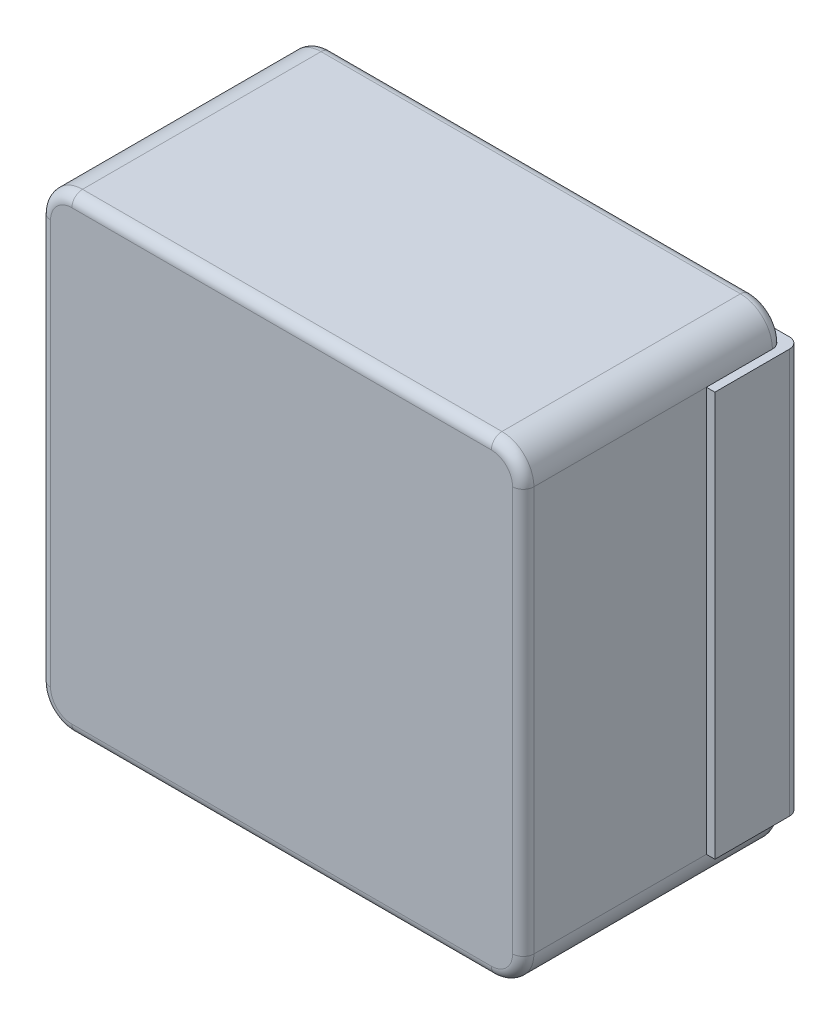
ISO-10303-21;
HEADER;
FILE_DESCRIPTION(('STEP AP214'),'2;1');
FILE_NAME('part.step','',(''),(''),'','','');
FILE_SCHEMA(('AUTOMOTIVE_DESIGN { 1 0 10303 214 1 1 1 1 }'));
ENDSEC;
DATA;
#1=APPLICATION_CONTEXT('core data for automotive mechanical design processes');
#2=APPLICATION_PROTOCOL_DEFINITION('international standard','automotive_design',2000,#1);
#3=PRODUCT_CONTEXT('',#1,'mechanical');
#4=PRODUCT('Part','Part','',(#3));
#5=PRODUCT_RELATED_PRODUCT_CATEGORY('part','',(#4));
#6=PRODUCT_DEFINITION_FORMATION('','',#4);
#7=PRODUCT_DEFINITION_CONTEXT('part definition',#1,'design');
#8=PRODUCT_DEFINITION('design','',#6,#7);
#9=PRODUCT_DEFINITION_SHAPE('','',#8);
#10=(LENGTH_UNIT() NAMED_UNIT(*) SI_UNIT(.MILLI.,.METRE.));
#11=(NAMED_UNIT(*) PLANE_ANGLE_UNIT() SI_UNIT($,.RADIAN.));
#12=(NAMED_UNIT(*) SI_UNIT($,.STERADIAN.) SOLID_ANGLE_UNIT());
#13=UNCERTAINTY_MEASURE_WITH_UNIT(LENGTH_MEASURE(1.E-05),#10,'distance_accuracy_value','');
#14=(GEOMETRIC_REPRESENTATION_CONTEXT(3) GLOBAL_UNCERTAINTY_ASSIGNED_CONTEXT((#13)) GLOBAL_UNIT_ASSIGNED_CONTEXT((#10,
#11,#12)) REPRESENTATION_CONTEXT('',''));
#15=CARTESIAN_POINT('',(0.,0.,0.));
#16=DIRECTION('',(0.,0.,1.));
#17=DIRECTION('',(1.,0.,0.));
#18=AXIS2_PLACEMENT_3D('',#15,#16,#17);
#19=CARTESIAN_POINT('',(-0.5625,-0.475,0.025));
#20=DIRECTION('',(0.,1.,0.));
#21=DIRECTION('',(0.,0.,1.));
#22=AXIS2_PLACEMENT_3D('',#19,#20,#21);
#23=CYLINDRICAL_SURFACE('',#22,0.0250000000000009);
#24=DIRECTION('',(0.,1.,0.));
#25=VECTOR('',#24,1.);
#26=CARTESIAN_POINT('',(-0.5625,0.,0.));
#27=LINE('',#26,#25);
#28=CARTESIAN_POINT('',(-0.5625,-0.475,0.));
#29=VERTEX_POINT('',#28);
#30=CARTESIAN_POINT('',(-0.5625,0.475,0.));
#31=VERTEX_POINT('',#30);
#32=EDGE_CURVE('E493',#29,#31,#27,.T.);
#33=ORIENTED_EDGE('',*,*,#32,.F.);
#34=CARTESIAN_POINT('',(-0.5625,-0.475,0.025));
#35=DIRECTION('',(0.,1.,0.));
#36=DIRECTION('',(0.,0.,1.));
#37=AXIS2_PLACEMENT_3D('',#34,#35,#36);
#38=CIRCLE('',#37,0.0250000000000009);
#39=CARTESIAN_POINT('',(-0.5875,-0.475,0.025));
#40=VERTEX_POINT('',#39);
#41=EDGE_CURVE('E21',#40,#29,#38,.F.);
#42=ORIENTED_EDGE('',*,*,#41,.F.);
#43=DIRECTION('',(0.,-1.,0.));
#44=VECTOR('',#43,1.);
#45=CARTESIAN_POINT('',(-0.5875,0.,0.025));
#46=LINE('',#45,#44);
#47=CARTESIAN_POINT('',(-0.5875,0.475,0.025));
#48=VERTEX_POINT('',#47);
#49=EDGE_CURVE('E138',#48,#40,#46,.T.);
#50=ORIENTED_EDGE('',*,*,#49,.F.);
#51=CARTESIAN_POINT('',(-0.5625,0.475,0.025));
#52=DIRECTION('',(0.,1.,0.));
#53=DIRECTION('',(0.,0.,1.));
#54=AXIS2_PLACEMENT_3D('',#51,#52,#53);
#55=CIRCLE('',#54,0.0250000000000009);
#56=EDGE_CURVE('E434',#31,#48,#55,.T.);
#57=ORIENTED_EDGE('',*,*,#56,.F.);
#58=EDGE_LOOP('',(#33,#42,#50,#57));
#59=FACE_BOUND('',#58,.T.);
#60=ADVANCED_FACE('F17',(#59),#23,.T.);
#61=CARTESIAN_POINT('',(-0.5875,-0.475,0.2));
#62=DIRECTION('',(-1.,0.,0.));
#63=DIRECTION('',(0.,1.,0.));
#64=AXIS2_PLACEMENT_3D('',#61,#62,#63);
#65=PLANE('',#64);
#66=DIRECTION('',(0.,0.,1.));
#67=VECTOR('',#66,1.);
#68=CARTESIAN_POINT('',(-0.5875,0.475,0.1));
#69=LINE('',#68,#67);
#70=CARTESIAN_POINT('',(-0.5875,0.475,0.2));
#71=VERTEX_POINT('',#70);
#72=EDGE_CURVE('E431',#48,#71,#69,.T.);
#73=ORIENTED_EDGE('',*,*,#72,.F.);
#74=ORIENTED_EDGE('',*,*,#49,.T.);
#75=DIRECTION('',(0.,0.,-1.));
#76=VECTOR('',#75,1.);
#77=CARTESIAN_POINT('',(-0.5875,-0.475,0.1));
#78=LINE('',#77,#76);
#79=CARTESIAN_POINT('',(-0.5875,-0.475,0.2));
#80=VERTEX_POINT('',#79);
#81=EDGE_CURVE('E468',#80,#40,#78,.T.);
#82=ORIENTED_EDGE('',*,*,#81,.F.);
#83=DIRECTION('',(0.,1.,0.));
#84=VECTOR('',#83,1.);
#85=CARTESIAN_POINT('',(-0.5875,0.,0.2));
#86=LINE('',#85,#84);
#87=EDGE_CURVE('E447',#80,#71,#86,.T.);
#88=ORIENTED_EDGE('',*,*,#87,.T.);
#89=EDGE_LOOP('',(#73,#74,#82,#88));
#90=FACE_BOUND('',#89,.T.);
#91=ADVANCED_FACE('F654',(#90),#65,.T.);
#92=CARTESIAN_POINT('',(-0.3375,0.475,0.02));
#93=DIRECTION('',(1.,0.,0.));
#94=DIRECTION('',(0.,-1.,0.));
#95=AXIS2_PLACEMENT_3D('',#92,#93,#94);
#96=PLANE('',#95);
#97=DIRECTION('',(0.,1.,0.));
#98=VECTOR('',#97,1.);
#99=CARTESIAN_POINT('',(-0.3375,0.,0.02));
#100=LINE('',#99,#98);
#101=CARTESIAN_POINT('',(-0.3375,-0.475,0.02));
#102=VERTEX_POINT('',#101);
#103=CARTESIAN_POINT('',(-0.3375,0.475,0.02));
#104=VERTEX_POINT('',#103);
#105=EDGE_CURVE('E484',#102,#104,#100,.T.);
#106=ORIENTED_EDGE('',*,*,#105,.F.);
#107=DIRECTION('',(0.,0.,1.));
#108=VECTOR('',#107,1.);
#109=CARTESIAN_POINT('',(-0.3375,-0.475,0.1));
#110=LINE('',#109,#108);
#111=CARTESIAN_POINT('',(-0.3375,-0.475,0.));
#112=VERTEX_POINT('',#111);
#113=EDGE_CURVE('E461',#112,#102,#110,.T.);
#114=ORIENTED_EDGE('',*,*,#113,.F.);
#115=DIRECTION('',(0.,-1.,0.));
#116=VECTOR('',#115,1.);
#117=CARTESIAN_POINT('',(-0.3375,0.,0.));
#118=LINE('',#117,#116);
#119=CARTESIAN_POINT('',(-0.3375,0.475,0.));
#120=VERTEX_POINT('',#119);
#121=EDGE_CURVE('E151',#120,#112,#118,.T.);
#122=ORIENTED_EDGE('',*,*,#121,.F.);
#123=DIRECTION('',(0.,0.,-1.));
#124=VECTOR('',#123,1.);
#125=CARTESIAN_POINT('',(-0.3375,0.475,0.1));
#126=LINE('',#125,#124);
#127=EDGE_CURVE('E422',#104,#120,#126,.T.);
#128=ORIENTED_EDGE('',*,*,#127,.F.);
#129=EDGE_LOOP('',(#106,#114,#122,#128));
#130=FACE_BOUND('',#129,.T.);
#131=ADVANCED_FACE('F656',(#130),#96,.T.);
#132=CARTESIAN_POINT('',(-0.3375,-0.475,0.));
#133=DIRECTION('',(0.,0.,-1.));
#134=DIRECTION('',(-1.,0.,0.));
#135=AXIS2_PLACEMENT_3D('',#132,#133,#134);
#136=PLANE('',#135);
#137=DIRECTION('',(1.,0.,0.));
#138=VECTOR('',#137,1.);
#139=CARTESIAN_POINT('',(-0.4625,-0.475,0.));
#140=LINE('',#139,#138);
#141=EDGE_CURVE('E464',#29,#112,#140,.T.);
#142=ORIENTED_EDGE('',*,*,#141,.F.);
#143=ORIENTED_EDGE('',*,*,#32,.T.);
#144=DIRECTION('',(-1.,0.,0.));
#145=VECTOR('',#144,1.);
#146=CARTESIAN_POINT('',(-0.4625,0.475,0.));
#147=LINE('',#146,#145);
#148=EDGE_CURVE('E419',#120,#31,#147,.T.);
#149=ORIENTED_EDGE('',*,*,#148,.F.);
#150=ORIENTED_EDGE('',*,*,#121,.T.);
#151=EDGE_LOOP('',(#142,#143,#149,#150));
#152=FACE_BOUND('',#151,.T.);
#153=ADVANCED_FACE('F663',(#152),#136,.T.);
#154=CARTESIAN_POINT('',(0.5625,0.475,0.025));
#155=DIRECTION('',(0.,-1.,0.));
#156=DIRECTION('',(0.,0.,-1.));
#157=AXIS2_PLACEMENT_3D('',#154,#155,#156);
#158=CYLINDRICAL_SURFACE('',#157,0.0250000000000009);
#159=DIRECTION('',(0.,-1.,0.));
#160=VECTOR('',#159,1.);
#161=CARTESIAN_POINT('',(0.5625,0.,0.));
#162=LINE('',#161,#160);
#163=CARTESIAN_POINT('',(0.5625,0.475,0.));
#164=VERTEX_POINT('',#163);
#165=CARTESIAN_POINT('',(0.5625,-0.475,0.));
#166=VERTEX_POINT('',#165);
#167=EDGE_CURVE('E473',#164,#166,#162,.T.);
#168=ORIENTED_EDGE('',*,*,#167,.F.);
#169=CARTESIAN_POINT('',(0.5625,0.475,0.025));
#170=DIRECTION('',(0.,-1.,0.));
#171=DIRECTION('',(0.,0.,-1.));
#172=AXIS2_PLACEMENT_3D('',#169,#170,#171);
#173=CIRCLE('',#172,0.0250000000000009);
#174=CARTESIAN_POINT('',(0.5875,0.475,0.025));
#175=VERTEX_POINT('',#174);
#176=EDGE_CURVE('E395',#175,#164,#173,.F.);
#177=ORIENTED_EDGE('',*,*,#176,.F.);
#178=DIRECTION('',(0.,1.,0.));
#179=VECTOR('',#178,1.);
#180=CARTESIAN_POINT('',(0.5875,0.,0.025));
#181=LINE('',#180,#179);
#182=CARTESIAN_POINT('',(0.5875,-0.475,0.025));
#183=VERTEX_POINT('',#182);
#184=EDGE_CURVE('E491',#183,#175,#181,.T.);
#185=ORIENTED_EDGE('',*,*,#184,.F.);
#186=CARTESIAN_POINT('',(0.5625,-0.475,0.025));
#187=DIRECTION('',(0.,-1.,0.));
#188=DIRECTION('',(0.,0.,-1.));
#189=AXIS2_PLACEMENT_3D('',#186,#187,#188);
#190=CIRCLE('',#189,0.0250000000000009);
#191=EDGE_CURVE('E337',#166,#183,#190,.T.);
#192=ORIENTED_EDGE('',*,*,#191,.F.);
#193=EDGE_LOOP('',(#168,#177,#185,#192));
#194=FACE_BOUND('',#193,.T.);
#195=ADVANCED_FACE('F756',(#194),#158,.T.);
#196=CARTESIAN_POINT('',(0.5875,0.475,0.2));
#197=DIRECTION('',(1.,0.,0.));
#198=DIRECTION('',(0.,-1.,0.));
#199=AXIS2_PLACEMENT_3D('',#196,#197,#198);
#200=PLANE('',#199);
#201=DIRECTION('',(0.,0.,1.));
#202=VECTOR('',#201,1.);
#203=CARTESIAN_POINT('',(0.5875,-0.475,0.1));
#204=LINE('',#203,#202);
#205=CARTESIAN_POINT('',(0.5875,-0.475,0.2));
#206=VERTEX_POINT('',#205);
#207=EDGE_CURVE('E334',#183,#206,#204,.T.);
#208=ORIENTED_EDGE('',*,*,#207,.F.);
#209=ORIENTED_EDGE('',*,*,#184,.T.);
#210=DIRECTION('',(0.,0.,-1.));
#211=VECTOR('',#210,1.);
#212=CARTESIAN_POINT('',(0.5875,0.475,0.1));
#213=LINE('',#212,#211);
#214=CARTESIAN_POINT('',(0.5875,0.475,0.2));
#215=VERTEX_POINT('',#214);
#216=EDGE_CURVE('E398',#215,#175,#213,.T.);
#217=ORIENTED_EDGE('',*,*,#216,.F.);
#218=DIRECTION('',(0.,-1.,0.));
#219=VECTOR('',#218,1.);
#220=CARTESIAN_POINT('',(0.5875,0.,0.2));
#221=LINE('',#220,#219);
#222=EDGE_CURVE('E353',#215,#206,#221,.T.);
#223=ORIENTED_EDGE('',*,*,#222,.T.);
#224=EDGE_LOOP('',(#208,#209,#217,#223));
#225=FACE_BOUND('',#224,.T.);
#226=ADVANCED_FACE('F753',(#225),#200,.T.);
#227=CARTESIAN_POINT('',(0.5425,-0.525,0.02));
#228=DIRECTION('',(0.,0.,-1.));
#229=DIRECTION('',(-1.,0.,0.));
#230=AXIS2_PLACEMENT_3D('',#227,#228,#229);
#231=PLANE('',#230);
#232=ORIENTED_EDGE('',*,*,#105,.T.);
#233=DIRECTION('',(1.,0.,0.));
#234=VECTOR('',#233,1.);
#235=CARTESIAN_POINT('',(-0.4625,0.475,0.02));
#236=LINE('',#235,#234);
#237=CARTESIAN_POINT('',(-0.5425,0.475,0.0199999999999995));
#238=VERTEX_POINT('',#237);
#239=EDGE_CURVE('E425',#238,#104,#236,.T.);
#240=ORIENTED_EDGE('',*,*,#239,.F.);
#241=CARTESIAN_POINT('',(-0.4925,0.475,0.019999999999999));
#242=DIRECTION('',(0.,0.,-1.));
#243=DIRECTION('',(-1.,0.,0.));
#244=AXIS2_PLACEMENT_3D('',#241,#242,#243);
#245=CIRCLE('',#244,0.05);
#246=CARTESIAN_POINT('',(-0.4925,0.525,0.0199999999999995));
#247=VERTEX_POINT('',#246);
#248=EDGE_CURVE('E446',#247,#238,#245,.F.);
#249=ORIENTED_EDGE('',*,*,#248,.F.);
#250=DIRECTION('',(-1.,0.,0.));
#251=VECTOR('',#250,1.);
#252=CARTESIAN_POINT('',(0.,0.525,0.02));
#253=LINE('',#252,#251);
#254=CARTESIAN_POINT('',(0.4925,0.525,0.0199999999999996));
#255=VERTEX_POINT('',#254);
#256=EDGE_CURVE('E405',#255,#247,#253,.T.);
#257=ORIENTED_EDGE('',*,*,#256,.F.);
#258=CARTESIAN_POINT('',(0.4925,0.475,0.0199999999999991));
#259=DIRECTION('',(0.,0.,-1.));
#260=DIRECTION('',(-1.,0.,0.));
#261=AXIS2_PLACEMENT_3D('',#258,#259,#260);
#262=CIRCLE('',#261,0.05);
#263=CARTESIAN_POINT('',(0.5425,0.475,0.0199999999999996));
#264=VERTEX_POINT('',#263);
#265=EDGE_CURVE('E371',#264,#255,#262,.F.);
#266=ORIENTED_EDGE('',*,*,#265,.F.);
#267=DIRECTION('',(1.,0.,0.));
#268=VECTOR('',#267,1.);
#269=CARTESIAN_POINT('',(0.4625,0.475,0.02));
#270=LINE('',#269,#268);
#271=CARTESIAN_POINT('',(0.3375,0.475,0.02));
#272=VERTEX_POINT('',#271);
#273=EDGE_CURVE('E385',#272,#264,#270,.T.);
#274=ORIENTED_EDGE('',*,*,#273,.F.);
#275=DIRECTION('',(0.,1.,0.));
#276=VECTOR('',#275,1.);
#277=CARTESIAN_POINT('',(0.3375,0.,0.02));
#278=LINE('',#277,#276);
#279=CARTESIAN_POINT('',(0.3375,-0.475,0.02));
#280=VERTEX_POINT('',#279);
#281=EDGE_CURVE('E476',#280,#272,#278,.T.);
#282=ORIENTED_EDGE('',*,*,#281,.F.);
#283=DIRECTION('',(-1.,0.,0.));
#284=VECTOR('',#283,1.);
#285=CARTESIAN_POINT('',(0.4625,-0.475,0.02));
#286=LINE('',#285,#284);
#287=CARTESIAN_POINT('',(0.5425,-0.475,0.0199999999999995));
#288=VERTEX_POINT('',#287);
#289=EDGE_CURVE('E329',#288,#280,#286,.T.);
#290=ORIENTED_EDGE('',*,*,#289,.F.);
#291=CARTESIAN_POINT('',(0.4925,-0.475,0.019999999999999));
#292=DIRECTION('',(0.,0.,-1.));
#293=DIRECTION('',(-1.,0.,0.));
#294=AXIS2_PLACEMENT_3D('',#291,#292,#293);
#295=CIRCLE('',#294,0.05);
#296=CARTESIAN_POINT('',(0.4925,-0.525,0.0199999999999995));
#297=VERTEX_POINT('',#296);
#298=EDGE_CURVE('E352',#297,#288,#295,.F.);
#299=ORIENTED_EDGE('',*,*,#298,.F.);
#300=DIRECTION('',(1.,0.,0.));
#301=VECTOR('',#300,1.);
#302=CARTESIAN_POINT('',(0.,-0.525,0.02));
#303=LINE('',#302,#301);
#304=CARTESIAN_POINT('',(-0.4925,-0.525,0.0199999999999996));
#305=VERTEX_POINT('',#304);
#306=EDGE_CURVE('E470',#305,#297,#303,.T.);
#307=ORIENTED_EDGE('',*,*,#306,.F.);
#308=CARTESIAN_POINT('',(-0.4925,-0.475,0.0199999999999991));
#309=DIRECTION('',(0.,0.,-1.));
#310=DIRECTION('',(-1.,0.,0.));
#311=AXIS2_PLACEMENT_3D('',#308,#309,#310);
#312=CIRCLE('',#311,0.05);
#313=CARTESIAN_POINT('',(-0.5425,-0.475,0.0199999999999996));
#314=VERTEX_POINT('',#313);
#315=EDGE_CURVE('E513',#314,#305,#312,.F.);
#316=ORIENTED_EDGE('',*,*,#315,.F.);
#317=DIRECTION('',(-1.,0.,0.));
#318=VECTOR('',#317,1.);
#319=CARTESIAN_POINT('',(-0.4625,-0.475,0.02));
#320=LINE('',#319,#318);
#321=EDGE_CURVE('E457',#102,#314,#320,.T.);
#322=ORIENTED_EDGE('',*,*,#321,.F.);
#323=EDGE_LOOP('',(#232,#240,#249,#257,#266,#274,#282,#290,#299,#307,#316,#322));
#324=FACE_BOUND('',#323,.T.);
#325=ADVANCED_FACE('F554',(#324),#231,.T.);
#326=CARTESIAN_POINT('',(0.3375,-0.475,0.02));
#327=DIRECTION('',(-1.,0.,0.));
#328=DIRECTION('',(0.,1.,0.));
#329=AXIS2_PLACEMENT_3D('',#326,#327,#328);
#330=PLANE('',#329);
#331=ORIENTED_EDGE('',*,*,#281,.T.);
#332=DIRECTION('',(0.,0.,1.));
#333=VECTOR('',#332,1.);
#334=CARTESIAN_POINT('',(0.3375,0.475,0.1));
#335=LINE('',#334,#333);
#336=CARTESIAN_POINT('',(0.3375,0.475,0.));
#337=VERTEX_POINT('',#336);
#338=EDGE_CURVE('E389',#337,#272,#335,.T.);
#339=ORIENTED_EDGE('',*,*,#338,.F.);
#340=DIRECTION('',(0.,1.,0.));
#341=VECTOR('',#340,1.);
#342=CARTESIAN_POINT('',(0.3375,0.,0.));
#343=LINE('',#342,#341);
#344=CARTESIAN_POINT('',(0.3375,-0.475,0.));
#345=VERTEX_POINT('',#344);
#346=EDGE_CURVE('E475',#345,#337,#343,.T.);
#347=ORIENTED_EDGE('',*,*,#346,.F.);
#348=DIRECTION('',(0.,0.,-1.));
#349=VECTOR('',#348,1.);
#350=CARTESIAN_POINT('',(0.3375,-0.475,0.1));
#351=LINE('',#350,#349);
#352=EDGE_CURVE('E326',#280,#345,#351,.T.);
#353=ORIENTED_EDGE('',*,*,#352,.F.);
#354=EDGE_LOOP('',(#331,#339,#347,#353));
#355=FACE_BOUND('',#354,.T.);
#356=ADVANCED_FACE('F746',(#355),#330,.T.);
#357=CARTESIAN_POINT('',(0.5625,-0.475,0.));
#358=DIRECTION('',(0.,0.,-1.));
#359=DIRECTION('',(-1.,0.,0.));
#360=AXIS2_PLACEMENT_3D('',#357,#358,#359);
#361=PLANE('',#360);
#362=DIRECTION('',(1.,0.,0.));
#363=VECTOR('',#362,1.);
#364=CARTESIAN_POINT('',(0.4625,-0.475,0.));
#365=LINE('',#364,#363);
#366=EDGE_CURVE('E323',#345,#166,#365,.T.);
#367=ORIENTED_EDGE('',*,*,#366,.F.);
#368=ORIENTED_EDGE('',*,*,#346,.T.);
#369=DIRECTION('',(-1.,0.,0.));
#370=VECTOR('',#369,1.);
#371=CARTESIAN_POINT('',(0.4625,0.475,0.));
#372=LINE('',#371,#370);
#373=EDGE_CURVE('E392',#164,#337,#372,.T.);
#374=ORIENTED_EDGE('',*,*,#373,.F.);
#375=ORIENTED_EDGE('',*,*,#167,.T.);
#376=EDGE_LOOP('',(#367,#368,#374,#375));
#377=FACE_BOUND('',#376,.T.);
#378=ADVANCED_FACE('F743',(#377),#361,.T.);
#379=CARTESIAN_POINT('',(0.4925,-0.525,0.045));
#380=DIRECTION('',(-1.,0.,0.));
#381=DIRECTION('',(0.,0.,1.));
#382=AXIS2_PLACEMENT_3D('',#379,#380,#381);
#383=CYLINDRICAL_SURFACE('',#382,0.0250000000000009);
#384=ORIENTED_EDGE('',*,*,#306,.T.);
#385=CARTESIAN_POINT('',(0.4925,-0.525,0.045));
#386=DIRECTION('',(1.,0.,0.));
#387=DIRECTION('',(0.,-1.,0.));
#388=AXIS2_PLACEMENT_3D('',#385,#386,#387);
#389=CIRCLE('',#388,0.0250000000000009);
#390=CARTESIAN_POINT('',(0.4925,-0.550000000000001,0.045));
#391=VERTEX_POINT('',#390);
#392=EDGE_CURVE('E349',#391,#297,#389,.T.);
#393=ORIENTED_EDGE('',*,*,#392,.F.);
#394=DIRECTION('',(1.,0.,0.));
#395=VECTOR('',#394,1.);
#396=CARTESIAN_POINT('',(0.,-0.55,0.045));
#397=LINE('',#396,#395);
#398=CARTESIAN_POINT('',(-0.4925,-0.550000000000001,0.045));
#399=VERTEX_POINT('',#398);
#400=EDGE_CURVE('E236',#399,#391,#397,.T.);
#401=ORIENTED_EDGE('',*,*,#400,.F.);
#402=CARTESIAN_POINT('',(-0.4925,-0.525,0.045));
#403=DIRECTION('',(-1.,0.,0.));
#404=DIRECTION('',(0.,-1.,0.));
#405=AXIS2_PLACEMENT_3D('',#402,#403,#404);
#406=CIRCLE('',#405,0.0250000000000009);
#407=EDGE_CURVE('E454',#305,#399,#406,.T.);
#408=ORIENTED_EDGE('',*,*,#407,.F.);
#409=EDGE_LOOP('',(#384,#393,#401,#408));
#410=FACE_BOUND('',#409,.T.);
#411=ADVANCED_FACE('F558',(#410),#383,.T.);
#412=CARTESIAN_POINT('',(-0.3375,-0.475,0.2));
#413=DIRECTION('',(0.,-1.,0.));
#414=DIRECTION('',(-1.,0.,0.));
#415=AXIS2_PLACEMENT_3D('',#412,#413,#414);
#416=PLANE('',#415);
#417=DIRECTION('',(0.,0.,-1.));
#418=VECTOR('',#417,1.);
#419=CARTESIAN_POINT('',(-0.5675,-0.475,0.325));
#420=LINE('',#419,#418);
#421=CARTESIAN_POINT('',(-0.5675,-0.475,0.2));
#422=VERTEX_POINT('',#421);
#423=CARTESIAN_POINT('',(-0.567500000000001,-0.475,0.045));
#424=VERTEX_POINT('',#423);
#425=EDGE_CURVE('E357',#422,#424,#420,.T.);
#426=ORIENTED_EDGE('',*,*,#425,.F.);
#427=DIRECTION('',(-1.,0.,0.));
#428=VECTOR('',#427,1.);
#429=CARTESIAN_POINT('',(-0.5775,-0.475,0.2));
#430=LINE('',#429,#428);
#431=EDGE_CURVE('E443',#422,#80,#430,.T.);
#432=ORIENTED_EDGE('',*,*,#431,.T.);
#433=ORIENTED_EDGE('',*,*,#81,.T.);
#434=ORIENTED_EDGE('',*,*,#41,.T.);
#435=ORIENTED_EDGE('',*,*,#141,.T.);
#436=ORIENTED_EDGE('',*,*,#113,.T.);
#437=ORIENTED_EDGE('',*,*,#321,.T.);
#438=CARTESIAN_POINT('',(-0.5425,-0.475,0.045));
#439=DIRECTION('',(0.,-1.,0.));
#440=DIRECTION('',(0.,0.,-1.));
#441=AXIS2_PLACEMENT_3D('',#438,#439,#440);
#442=CIRCLE('',#441,0.0250000000000009);
#443=EDGE_CURVE('E456',#424,#314,#442,.T.);
#444=ORIENTED_EDGE('',*,*,#443,.F.);
#445=EDGE_LOOP('',(#426,#432,#433,#434,#435,#436,#437,#444));
#446=FACE_BOUND('',#445,.T.);
#447=ADVANCED_FACE('F638',(#446),#416,.T.);
#448=CARTESIAN_POINT('',(-0.4925,-0.475,0.045));
#449=DIRECTION('',(0.,0.,-1.));
#450=DIRECTION('',(-1.,0.,0.));
#451=AXIS2_PLACEMENT_3D('',#448,#449,#450);
#452=TOROIDAL_SURFACE('',#451,0.05,0.0250000000000009);
#453=ORIENTED_EDGE('',*,*,#443,.T.);
#454=ORIENTED_EDGE('',*,*,#315,.T.);
#455=ORIENTED_EDGE('',*,*,#407,.T.);
#456=CARTESIAN_POINT('',(-0.4925,-0.475,0.045));
#457=DIRECTION('',(0.,0.,1.));
#458=DIRECTION('',(-1.,0.,0.));
#459=AXIS2_PLACEMENT_3D('',#456,#457,#458);
#460=CIRCLE('',#459,0.0750000000000027);
#461=EDGE_CURVE('E320',#424,#399,#460,.T.);
#462=ORIENTED_EDGE('',*,*,#461,.F.);
#463=EDGE_LOOP('',(#453,#454,#455,#462));
#464=FACE_BOUND('',#463,.T.);
#465=ADVANCED_FACE('F549',(#464),#452,.T.);
#466=CARTESIAN_POINT('',(-0.5675,-0.475,0.2));
#467=DIRECTION('',(0.,0.,-1.));
#468=DIRECTION('',(-1.,0.,0.));
#469=AXIS2_PLACEMENT_3D('',#466,#467,#468);
#470=PLANE('',#469);
#471=DIRECTION('',(0.,-1.,0.));
#472=VECTOR('',#471,1.);
#473=CARTESIAN_POINT('',(-0.5675,0.,0.2));
#474=LINE('',#473,#472);
#475=CARTESIAN_POINT('',(-0.5675,0.475,0.2));
#476=VERTEX_POINT('',#475);
#477=EDGE_CURVE('E315',#476,#422,#474,.T.);
#478=ORIENTED_EDGE('',*,*,#477,.F.);
#479=DIRECTION('',(1.,0.,0.));
#480=VECTOR('',#479,1.);
#481=CARTESIAN_POINT('',(-0.4625,0.475,0.2));
#482=LINE('',#481,#480);
#483=EDGE_CURVE('E433',#71,#476,#482,.T.);
#484=ORIENTED_EDGE('',*,*,#483,.F.);
#485=ORIENTED_EDGE('',*,*,#87,.F.);
#486=ORIENTED_EDGE('',*,*,#431,.F.);
#487=EDGE_LOOP('',(#478,#484,#485,#486));
#488=FACE_BOUND('',#487,.T.);
#489=ADVANCED_FACE('F641',(#488),#470,.F.);
#490=CARTESIAN_POINT('',(-0.4925,0.475,0.0449999999999999));
#491=DIRECTION('',(0.,0.,-1.));
#492=DIRECTION('',(-1.,0.,0.));
#493=AXIS2_PLACEMENT_3D('',#490,#491,#492);
#494=TOROIDAL_SURFACE('',#493,0.05,0.0250000000000008);
#495=CARTESIAN_POINT('',(-0.4925,0.525,0.045));
#496=DIRECTION('',(1.,0.,0.));
#497=DIRECTION('',(0.,0.,-1.));
#498=AXIS2_PLACEMENT_3D('',#495,#496,#497);
#499=CIRCLE('',#498,0.0250000000000009);
#500=CARTESIAN_POINT('',(-0.4925,0.550000000000001,0.045));
#501=VERTEX_POINT('',#500);
#502=EDGE_CURVE('E401',#247,#501,#499,.T.);
#503=ORIENTED_EDGE('',*,*,#502,.F.);
#504=ORIENTED_EDGE('',*,*,#248,.T.);
#505=CARTESIAN_POINT('',(-0.5425,0.475,0.0449999999999999));
#506=DIRECTION('',(0.,-1.,0.));
#507=DIRECTION('',(0.,0.,-1.));
#508=AXIS2_PLACEMENT_3D('',#505,#506,#507);
#509=CIRCLE('',#508,0.0250000000000008);
#510=CARTESIAN_POINT('',(-0.567500000000001,0.475,0.045));
#511=VERTEX_POINT('',#510);
#512=EDGE_CURVE('E428',#511,#238,#509,.T.);
#513=ORIENTED_EDGE('',*,*,#512,.F.);
#514=CARTESIAN_POINT('',(-0.4925,0.475,0.045));
#515=DIRECTION('',(0.,0.,1.));
#516=DIRECTION('',(0.,1.,0.));
#517=AXIS2_PLACEMENT_3D('',#514,#515,#516);
#518=CIRCLE('',#517,0.0750000000000027);
#519=EDGE_CURVE('E314',#501,#511,#518,.T.);
#520=ORIENTED_EDGE('',*,*,#519,.F.);
#521=EDGE_LOOP('',(#503,#504,#513,#520));
#522=FACE_BOUND('',#521,.T.);
#523=ADVANCED_FACE('F731',(#522),#494,.T.);
#524=CARTESIAN_POINT('',(-0.5875,0.475,0.2));
#525=DIRECTION('',(0.,1.,0.));
#526=DIRECTION('',(1.,0.,0.));
#527=AXIS2_PLACEMENT_3D('',#524,#525,#526);
#528=PLANE('',#527);
#529=ORIENTED_EDGE('',*,*,#127,.T.);
#530=ORIENTED_EDGE('',*,*,#148,.T.);
#531=ORIENTED_EDGE('',*,*,#56,.T.);
#532=ORIENTED_EDGE('',*,*,#72,.T.);
#533=ORIENTED_EDGE('',*,*,#483,.T.);
#534=DIRECTION('',(0.,0.,1.));
#535=VECTOR('',#534,1.);
#536=CARTESIAN_POINT('',(-0.5675,0.475,0.325));
#537=LINE('',#536,#535);
#538=EDGE_CURVE('E299',#511,#476,#537,.T.);
#539=ORIENTED_EDGE('',*,*,#538,.F.);
#540=ORIENTED_EDGE('',*,*,#512,.T.);
#541=ORIENTED_EDGE('',*,*,#239,.T.);
#542=EDGE_LOOP('',(#529,#530,#531,#532,#533,#539,#540,#541));
#543=FACE_BOUND('',#542,.T.);
#544=ADVANCED_FACE('F651',(#543),#528,.T.);
#545=CARTESIAN_POINT('',(-0.4925,0.525,0.045));
#546=DIRECTION('',(1.,0.,0.));
#547=DIRECTION('',(0.,0.,-1.));
#548=AXIS2_PLACEMENT_3D('',#545,#546,#547);
#549=CYLINDRICAL_SURFACE('',#548,0.0250000000000009);
#550=ORIENTED_EDGE('',*,*,#256,.T.);
#551=ORIENTED_EDGE('',*,*,#502,.T.);
#552=DIRECTION('',(-1.,0.,0.));
#553=VECTOR('',#552,1.);
#554=CARTESIAN_POINT('',(0.,0.55,0.045));
#555=LINE('',#554,#553);
#556=CARTESIAN_POINT('',(0.4925,0.550000000000001,0.045));
#557=VERTEX_POINT('',#556);
#558=EDGE_CURVE('E294',#557,#501,#555,.T.);
#559=ORIENTED_EDGE('',*,*,#558,.F.);
#560=CARTESIAN_POINT('',(0.4925,0.525,0.045));
#561=DIRECTION('',(1.,0.,0.));
#562=DIRECTION('',(0.,1.,0.));
#563=AXIS2_PLACEMENT_3D('',#560,#561,#562);
#564=CIRCLE('',#563,0.0250000000000009);
#565=EDGE_CURVE('E382',#255,#557,#564,.T.);
#566=ORIENTED_EDGE('',*,*,#565,.F.);
#567=EDGE_LOOP('',(#550,#551,#559,#566));
#568=FACE_BOUND('',#567,.T.);
#569=ADVANCED_FACE('F724',(#568),#549,.T.);
#570=CARTESIAN_POINT('',(0.3375,0.475,0.2));
#571=DIRECTION('',(0.,1.,0.));
#572=DIRECTION('',(1.,0.,0.));
#573=AXIS2_PLACEMENT_3D('',#570,#571,#572);
#574=PLANE('',#573);
#575=DIRECTION('',(0.,0.,-1.));
#576=VECTOR('',#575,1.);
#577=CARTESIAN_POINT('',(0.5675,0.475,0.325));
#578=LINE('',#577,#576);
#579=CARTESIAN_POINT('',(0.5675,0.475,0.2));
#580=VERTEX_POINT('',#579);
#581=CARTESIAN_POINT('',(0.567500000000001,0.475,0.045));
#582=VERTEX_POINT('',#581);
#583=EDGE_CURVE('E364',#580,#582,#578,.T.);
#584=ORIENTED_EDGE('',*,*,#583,.F.);
#585=DIRECTION('',(1.,0.,0.));
#586=VECTOR('',#585,1.);
#587=CARTESIAN_POINT('',(0.5775,0.475,0.2));
#588=LINE('',#587,#586);
#589=EDGE_CURVE('E368',#580,#215,#588,.T.);
#590=ORIENTED_EDGE('',*,*,#589,.T.);
#591=ORIENTED_EDGE('',*,*,#216,.T.);
#592=ORIENTED_EDGE('',*,*,#176,.T.);
#593=ORIENTED_EDGE('',*,*,#373,.T.);
#594=ORIENTED_EDGE('',*,*,#338,.T.);
#595=ORIENTED_EDGE('',*,*,#273,.T.);
#596=CARTESIAN_POINT('',(0.5425,0.475,0.045));
#597=DIRECTION('',(0.,1.,0.));
#598=DIRECTION('',(-1.,0.,0.));
#599=AXIS2_PLACEMENT_3D('',#596,#597,#598);
#600=CIRCLE('',#599,0.0250000000000009);
#601=EDGE_CURVE('E384',#582,#264,#600,.T.);
#602=ORIENTED_EDGE('',*,*,#601,.F.);
#603=EDGE_LOOP('',(#584,#590,#591,#592,#593,#594,#595,#602));
#604=FACE_BOUND('',#603,.T.);
#605=ADVANCED_FACE('F720',(#604),#574,.T.);
#606=CARTESIAN_POINT('',(0.4925,0.475,0.045));
#607=DIRECTION('',(0.,0.,-1.));
#608=DIRECTION('',(-1.,0.,0.));
#609=AXIS2_PLACEMENT_3D('',#606,#607,#608);
#610=TOROIDAL_SURFACE('',#609,0.05,0.0250000000000009);
#611=ORIENTED_EDGE('',*,*,#601,.T.);
#612=ORIENTED_EDGE('',*,*,#265,.T.);
#613=ORIENTED_EDGE('',*,*,#565,.T.);
#614=CARTESIAN_POINT('',(0.4925,0.475,0.045));
#615=DIRECTION('',(0.,0.,1.));
#616=DIRECTION('',(1.,0.,0.));
#617=AXIS2_PLACEMENT_3D('',#614,#615,#616);
#618=CIRCLE('',#617,0.0750000000000027);
#619=EDGE_CURVE('E277',#582,#557,#618,.T.);
#620=ORIENTED_EDGE('',*,*,#619,.F.);
#621=EDGE_LOOP('',(#611,#612,#613,#620));
#622=FACE_BOUND('',#621,.T.);
#623=ADVANCED_FACE('F716',(#622),#610,.T.);
#624=CARTESIAN_POINT('',(0.5875,-0.475,0.2));
#625=DIRECTION('',(0.,0.,-1.));
#626=DIRECTION('',(-1.,0.,0.));
#627=AXIS2_PLACEMENT_3D('',#624,#625,#626);
#628=PLANE('',#627);
#629=ORIENTED_EDGE('',*,*,#222,.F.);
#630=ORIENTED_EDGE('',*,*,#589,.F.);
#631=DIRECTION('',(0.,1.,0.));
#632=VECTOR('',#631,1.);
#633=CARTESIAN_POINT('',(0.5675,0.,0.2));
#634=LINE('',#633,#632);
#635=CARTESIAN_POINT('',(0.5675,-0.475,0.2));
#636=VERTEX_POINT('',#635);
#637=EDGE_CURVE('E272',#636,#580,#634,.T.);
#638=ORIENTED_EDGE('',*,*,#637,.F.);
#639=DIRECTION('',(-1.,0.,0.));
#640=VECTOR('',#639,1.);
#641=CARTESIAN_POINT('',(0.4625,-0.475,0.2));
#642=LINE('',#641,#640);
#643=EDGE_CURVE('E336',#206,#636,#642,.T.);
#644=ORIENTED_EDGE('',*,*,#643,.F.);
#645=EDGE_LOOP('',(#629,#630,#638,#644));
#646=FACE_BOUND('',#645,.T.);
#647=ADVANCED_FACE('F713',(#646),#628,.F.);
#648=CARTESIAN_POINT('',(0.4925,-0.475,0.0449999999999999));
#649=DIRECTION('',(0.,0.,-1.));
#650=DIRECTION('',(-1.,0.,0.));
#651=AXIS2_PLACEMENT_3D('',#648,#649,#650);
#652=TOROIDAL_SURFACE('',#651,0.05,0.0250000000000008);
#653=ORIENTED_EDGE('',*,*,#392,.T.);
#654=ORIENTED_EDGE('',*,*,#298,.T.);
#655=CARTESIAN_POINT('',(0.5425,-0.475,0.0449999999999999));
#656=DIRECTION('',(0.,1.,0.));
#657=DIRECTION('',(-1.,0.,0.));
#658=AXIS2_PLACEMENT_3D('',#655,#656,#657);
#659=CIRCLE('',#658,0.0250000000000008);
#660=CARTESIAN_POINT('',(0.567500000000001,-0.475,0.045));
#661=VERTEX_POINT('',#660);
#662=EDGE_CURVE('E331',#661,#288,#659,.T.);
#663=ORIENTED_EDGE('',*,*,#662,.F.);
#664=CARTESIAN_POINT('',(0.4925,-0.475,0.045));
#665=DIRECTION('',(0.,0.,1.));
#666=DIRECTION('',(0.,-1.,0.));
#667=AXIS2_PLACEMENT_3D('',#664,#665,#666);
#668=CIRCLE('',#667,0.0750000000000027);
#669=EDGE_CURVE('E239',#391,#661,#668,.T.);
#670=ORIENTED_EDGE('',*,*,#669,.F.);
#671=EDGE_LOOP('',(#653,#654,#663,#670));
#672=FACE_BOUND('',#671,.T.);
#673=ADVANCED_FACE('F561',(#672),#652,.T.);
#674=CARTESIAN_POINT('',(0.5875,-0.475,0.2));
#675=DIRECTION('',(0.,-1.,0.));
#676=DIRECTION('',(-1.,0.,0.));
#677=AXIS2_PLACEMENT_3D('',#674,#675,#676);
#678=PLANE('',#677);
#679=ORIENTED_EDGE('',*,*,#352,.T.);
#680=ORIENTED_EDGE('',*,*,#366,.T.);
#681=ORIENTED_EDGE('',*,*,#191,.T.);
#682=ORIENTED_EDGE('',*,*,#207,.T.);
#683=ORIENTED_EDGE('',*,*,#643,.T.);
#684=DIRECTION('',(0.,0.,1.));
#685=VECTOR('',#684,1.);
#686=CARTESIAN_POINT('',(0.5675,-0.475,0.325));
#687=LINE('',#686,#685);
#688=EDGE_CURVE('E226',#661,#636,#687,.T.);
#689=ORIENTED_EDGE('',*,*,#688,.F.);
#690=ORIENTED_EDGE('',*,*,#662,.T.);
#691=ORIENTED_EDGE('',*,*,#289,.T.);
#692=EDGE_LOOP('',(#679,#680,#681,#682,#683,#689,#690,#691));
#693=FACE_BOUND('',#692,.T.);
#694=ADVANCED_FACE('F708',(#693),#678,.T.);
#695=CARTESIAN_POINT('',(0.4925,-0.55,0.605));
#696=DIRECTION('',(0.,-1.,0.));
#697=DIRECTION('',(-1.,0.,0.));
#698=AXIS2_PLACEMENT_3D('',#695,#696,#697);
#699=PLANE('',#698);
#700=DIRECTION('',(0.,0.,1.));
#701=VECTOR('',#700,1.);
#702=CARTESIAN_POINT('',(-0.4925,-0.55,0.325));
#703=LINE('',#702,#701);
#704=CARTESIAN_POINT('',(-0.4925,-0.550000000000001,0.605));
#705=VERTEX_POINT('',#704);
#706=EDGE_CURVE('E318',#399,#705,#703,.T.);
#707=ORIENTED_EDGE('',*,*,#706,.F.);
#708=ORIENTED_EDGE('',*,*,#400,.T.);
#709=DIRECTION('',(0.,0.,-1.));
#710=VECTOR('',#709,1.);
#711=CARTESIAN_POINT('',(0.4925,-0.55,0.325));
#712=LINE('',#711,#710);
#713=CARTESIAN_POINT('',(0.4925,-0.550000000000001,0.605));
#714=VERTEX_POINT('',#713);
#715=EDGE_CURVE('E233',#714,#391,#712,.T.);
#716=ORIENTED_EDGE('',*,*,#715,.F.);
#717=DIRECTION('',(1.,0.,0.));
#718=VECTOR('',#717,1.);
#719=CARTESIAN_POINT('',(0.,-0.55,0.605));
#720=LINE('',#719,#718);
#721=EDGE_CURVE('E216',#705,#714,#720,.T.);
#722=ORIENTED_EDGE('',*,*,#721,.F.);
#723=EDGE_LOOP('',(#707,#708,#716,#722));
#724=FACE_BOUND('',#723,.T.);
#725=ADVANCED_FACE('F234',(#724),#699,.T.);
#726=CARTESIAN_POINT('',(-0.4925,-0.475,0.045));
#727=DIRECTION('',(0.,0.,1.));
#728=DIRECTION('',(1.,0.,0.));
#729=AXIS2_PLACEMENT_3D('',#726,#727,#728);
#730=CYLINDRICAL_SURFACE('',#729,0.0750000000000027);
#731=ORIENTED_EDGE('',*,*,#461,.T.);
#732=ORIENTED_EDGE('',*,*,#706,.T.);
#733=CARTESIAN_POINT('',(-0.4925,-0.475,0.605));
#734=DIRECTION('',(0.,0.,1.));
#735=DIRECTION('',(0.,-1.,0.));
#736=AXIS2_PLACEMENT_3D('',#733,#734,#735);
#737=CIRCLE('',#736,0.0750000000000027);
#738=CARTESIAN_POINT('',(-0.567500000000001,-0.475,0.605));
#739=VERTEX_POINT('',#738);
#740=EDGE_CURVE('E306',#739,#705,#737,.T.);
#741=ORIENTED_EDGE('',*,*,#740,.F.);
#742=DIRECTION('',(0.,0.,1.));
#743=VECTOR('',#742,1.);
#744=CARTESIAN_POINT('',(-0.5675,-0.475,0.4025));
#745=LINE('',#744,#743);
#746=EDGE_CURVE('E312',#422,#739,#745,.T.);
#747=ORIENTED_EDGE('',*,*,#746,.F.);
#748=ORIENTED_EDGE('',*,*,#425,.T.);
#749=EDGE_LOOP('',(#731,#732,#741,#747,#748));
#750=FACE_BOUND('',#749,.T.);
#751=ADVANCED_FACE('F637',(#750),#730,.T.);
#752=CARTESIAN_POINT('',(-0.5675,-0.475,0.605));
#753=DIRECTION('',(-1.,0.,0.));
#754=DIRECTION('',(0.,1.,0.));
#755=AXIS2_PLACEMENT_3D('',#752,#753,#754);
#756=PLANE('',#755);
#757=DIRECTION('',(0.,-1.,0.));
#758=VECTOR('',#757,1.);
#759=CARTESIAN_POINT('',(-0.5675,0.,0.605));
#760=LINE('',#759,#758);
#761=CARTESIAN_POINT('',(-0.567500000000001,0.475,0.605));
#762=VERTEX_POINT('',#761);
#763=EDGE_CURVE('E302',#762,#739,#760,.T.);
#764=ORIENTED_EDGE('',*,*,#763,.F.);
#765=DIRECTION('',(0.,0.,1.));
#766=VECTOR('',#765,1.);
#767=CARTESIAN_POINT('',(-0.5675,0.475,0.325));
#768=LINE('',#767,#766);
#769=EDGE_CURVE('E295',#476,#762,#768,.T.);
#770=ORIENTED_EDGE('',*,*,#769,.F.);
#771=ORIENTED_EDGE('',*,*,#477,.T.);
#772=ORIENTED_EDGE('',*,*,#746,.T.);
#773=EDGE_LOOP('',(#764,#770,#771,#772));
#774=FACE_BOUND('',#773,.T.);
#775=ADVANCED_FACE('F643',(#774),#756,.T.);
#776=CARTESIAN_POINT('',(-0.4925,0.475,0.045));
#777=DIRECTION('',(0.,0.,1.));
#778=DIRECTION('',(1.,0.,0.));
#779=AXIS2_PLACEMENT_3D('',#776,#777,#778);
#780=CYLINDRICAL_SURFACE('',#779,0.0750000000000027);
#781=ORIENTED_EDGE('',*,*,#769,.T.);
#782=CARTESIAN_POINT('',(-0.4925,0.475,0.605));
#783=DIRECTION('',(0.,0.,1.));
#784=DIRECTION('',(-1.,0.,0.));
#785=AXIS2_PLACEMENT_3D('',#782,#783,#784);
#786=CIRCLE('',#785,0.0750000000000027);
#787=CARTESIAN_POINT('',(-0.4925,0.550000000000001,0.605));
#788=VERTEX_POINT('',#787);
#789=EDGE_CURVE('E284',#788,#762,#786,.T.);
#790=ORIENTED_EDGE('',*,*,#789,.F.);
#791=DIRECTION('',(0.,0.,1.));
#792=VECTOR('',#791,1.);
#793=CARTESIAN_POINT('',(-0.4925,0.55,0.325));
#794=LINE('',#793,#792);
#795=EDGE_CURVE('E292',#501,#788,#794,.T.);
#796=ORIENTED_EDGE('',*,*,#795,.F.);
#797=ORIENTED_EDGE('',*,*,#519,.T.);
#798=ORIENTED_EDGE('',*,*,#538,.T.);
#799=EDGE_LOOP('',(#781,#790,#796,#797,#798));
#800=FACE_BOUND('',#799,.T.);
#801=ADVANCED_FACE('F645',(#800),#780,.T.);
#802=CARTESIAN_POINT('',(-0.4925,0.55,0.605));
#803=DIRECTION('',(0.,1.,0.));
#804=DIRECTION('',(1.,0.,0.));
#805=AXIS2_PLACEMENT_3D('',#802,#803,#804);
#806=PLANE('',#805);
#807=DIRECTION('',(0.,0.,1.));
#808=VECTOR('',#807,1.);
#809=CARTESIAN_POINT('',(0.4925,0.55,0.325));
#810=LINE('',#809,#808);
#811=CARTESIAN_POINT('',(0.4925,0.550000000000001,0.605));
#812=VERTEX_POINT('',#811);
#813=EDGE_CURVE('E275',#557,#812,#810,.T.);
#814=ORIENTED_EDGE('',*,*,#813,.F.);
#815=ORIENTED_EDGE('',*,*,#558,.T.);
#816=ORIENTED_EDGE('',*,*,#795,.T.);
#817=DIRECTION('',(-1.,0.,0.));
#818=VECTOR('',#817,1.);
#819=CARTESIAN_POINT('',(0.,0.55,0.605));
#820=LINE('',#819,#818);
#821=EDGE_CURVE('E280',#812,#788,#820,.T.);
#822=ORIENTED_EDGE('',*,*,#821,.F.);
#823=EDGE_LOOP('',(#814,#815,#816,#822));
#824=FACE_BOUND('',#823,.T.);
#825=ADVANCED_FACE('F696',(#824),#806,.T.);
#826=CARTESIAN_POINT('',(0.4925,0.475,0.045));
#827=DIRECTION('',(0.,0.,1.));
#828=DIRECTION('',(1.,0.,0.));
#829=AXIS2_PLACEMENT_3D('',#826,#827,#828);
#830=CYLINDRICAL_SURFACE('',#829,0.0750000000000027);
#831=ORIENTED_EDGE('',*,*,#619,.T.);
#832=ORIENTED_EDGE('',*,*,#813,.T.);
#833=CARTESIAN_POINT('',(0.4925,0.475,0.605));
#834=DIRECTION('',(0.,0.,1.));
#835=DIRECTION('',(0.,1.,0.));
#836=AXIS2_PLACEMENT_3D('',#833,#834,#835);
#837=CIRCLE('',#836,0.0750000000000027);
#838=CARTESIAN_POINT('',(0.567500000000001,0.475,0.605));
#839=VERTEX_POINT('',#838);
#840=EDGE_CURVE('E259',#839,#812,#837,.T.);
#841=ORIENTED_EDGE('',*,*,#840,.F.);
#842=DIRECTION('',(0.,0.,1.));
#843=VECTOR('',#842,1.);
#844=CARTESIAN_POINT('',(0.5675,0.475,0.4025));
#845=LINE('',#844,#843);
#846=EDGE_CURVE('E263',#580,#839,#845,.T.);
#847=ORIENTED_EDGE('',*,*,#846,.F.);
#848=ORIENTED_EDGE('',*,*,#583,.T.);
#849=EDGE_LOOP('',(#831,#832,#841,#847,#848));
#850=FACE_BOUND('',#849,.T.);
#851=ADVANCED_FACE('F577',(#850),#830,.T.);
#852=CARTESIAN_POINT('',(0.5675,0.475,0.605));
#853=DIRECTION('',(1.,0.,0.));
#854=DIRECTION('',(0.,-1.,0.));
#855=AXIS2_PLACEMENT_3D('',#852,#853,#854);
#856=PLANE('',#855);
#857=DIRECTION('',(0.,1.,0.));
#858=VECTOR('',#857,1.);
#859=CARTESIAN_POINT('',(0.5675,0.,0.605));
#860=LINE('',#859,#858);
#861=CARTESIAN_POINT('',(0.567500000000001,-0.475,0.605));
#862=VERTEX_POINT('',#861);
#863=EDGE_CURVE('E255',#862,#839,#860,.T.);
#864=ORIENTED_EDGE('',*,*,#863,.F.);
#865=DIRECTION('',(0.,0.,1.));
#866=VECTOR('',#865,1.);
#867=CARTESIAN_POINT('',(0.5675,-0.475,0.325));
#868=LINE('',#867,#866);
#869=EDGE_CURVE('E240',#636,#862,#868,.T.);
#870=ORIENTED_EDGE('',*,*,#869,.F.);
#871=ORIENTED_EDGE('',*,*,#637,.T.);
#872=ORIENTED_EDGE('',*,*,#846,.T.);
#873=EDGE_LOOP('',(#864,#870,#871,#872));
#874=FACE_BOUND('',#873,.T.);
#875=ADVANCED_FACE('F566',(#874),#856,.T.);
#876=CARTESIAN_POINT('',(0.4925,-0.475,0.045));
#877=DIRECTION('',(0.,0.,1.));
#878=DIRECTION('',(1.,0.,0.));
#879=AXIS2_PLACEMENT_3D('',#876,#877,#878);
#880=CYLINDRICAL_SURFACE('',#879,0.0750000000000027);
#881=ORIENTED_EDGE('',*,*,#669,.T.);
#882=ORIENTED_EDGE('',*,*,#688,.T.);
#883=ORIENTED_EDGE('',*,*,#869,.T.);
#884=CARTESIAN_POINT('',(0.4925,-0.475,0.605));
#885=DIRECTION('',(0.,0.,1.));
#886=DIRECTION('',(1.,0.,0.));
#887=AXIS2_PLACEMENT_3D('',#884,#885,#886);
#888=CIRCLE('',#887,0.0750000000000027);
#889=EDGE_CURVE('E230',#714,#862,#888,.T.);
#890=ORIENTED_EDGE('',*,*,#889,.F.);
#891=ORIENTED_EDGE('',*,*,#715,.T.);
#892=EDGE_LOOP('',(#881,#882,#883,#890,#891));
#893=FACE_BOUND('',#892,.T.);
#894=ADVANCED_FACE('F242',(#893),#880,.T.);
#895=CARTESIAN_POINT('',(0.4925,-0.525,0.605));
#896=DIRECTION('',(-1.,0.,0.));
#897=DIRECTION('',(0.,0.,1.));
#898=AXIS2_PLACEMENT_3D('',#895,#896,#897);
#899=CYLINDRICAL_SURFACE('',#898,0.0250000000000009);
#900=ORIENTED_EDGE('',*,*,#721,.T.);
#901=CARTESIAN_POINT('',(0.4925,-0.525,0.605));
#902=DIRECTION('',(1.,0.,0.));
#903=DIRECTION('',(0.,0.,1.));
#904=AXIS2_PLACEMENT_3D('',#901,#902,#903);
#905=CIRCLE('',#904,0.0250000000000009);
#906=CARTESIAN_POINT('',(0.4925,-0.525,0.630000000000001));
#907=VERTEX_POINT('',#906);
#908=EDGE_CURVE('E220',#907,#714,#905,.T.);
#909=ORIENTED_EDGE('',*,*,#908,.F.);
#910=DIRECTION('',(-1.,0.,0.));
#911=VECTOR('',#910,1.);
#912=CARTESIAN_POINT('',(0.,-0.525,0.63));
#913=LINE('',#912,#911);
#914=CARTESIAN_POINT('',(-0.4925,-0.525,0.63));
#915=VERTEX_POINT('',#914);
#916=EDGE_CURVE('E246',#907,#915,#913,.T.);
#917=ORIENTED_EDGE('',*,*,#916,.T.);
#918=CARTESIAN_POINT('',(-0.4925,-0.525,0.605));
#919=DIRECTION('',(-1.,0.,0.));
#920=DIRECTION('',(0.,0.,1.));
#921=AXIS2_PLACEMENT_3D('',#918,#919,#920);
#922=CIRCLE('',#921,0.0250000000000009);
#923=EDGE_CURVE('E221',#705,#915,#922,.T.);
#924=ORIENTED_EDGE('',*,*,#923,.F.);
#925=EDGE_LOOP('',(#900,#909,#917,#924));
#926=FACE_BOUND('',#925,.T.);
#927=ADVANCED_FACE('F218',(#926),#899,.T.);
#928=CARTESIAN_POINT('',(-0.4925,-0.475,0.605));
#929=DIRECTION('',(0.,0.,-1.));
#930=DIRECTION('',(-1.,0.,0.));
#931=AXIS2_PLACEMENT_3D('',#928,#929,#930);
#932=TOROIDAL_SURFACE('',#931,0.0500000000000001,0.0250000000000009);
#933=CARTESIAN_POINT('',(-0.5425,-0.475,0.605));
#934=DIRECTION('',(0.,1.,0.));
#935=DIRECTION('',(-1.,0.,0.));
#936=AXIS2_PLACEMENT_3D('',#933,#934,#935);
#937=CIRCLE('',#936,0.0250000000000009);
#938=CARTESIAN_POINT('',(-0.5425,-0.475,0.63));
#939=VERTEX_POINT('',#938);
#940=EDGE_CURVE('E305',#739,#939,#937,.T.);
#941=ORIENTED_EDGE('',*,*,#940,.F.);
#942=ORIENTED_EDGE('',*,*,#740,.T.);
#943=ORIENTED_EDGE('',*,*,#923,.T.);
#944=CARTESIAN_POINT('',(-0.4925,-0.475,0.630000000000001));
#945=DIRECTION('',(0.,0.,-1.));
#946=DIRECTION('',(-1.,0.,0.));
#947=AXIS2_PLACEMENT_3D('',#944,#945,#946);
#948=CIRCLE('',#947,0.0500000000000001);
#949=EDGE_CURVE('E248',#915,#939,#948,.T.);
#950=ORIENTED_EDGE('',*,*,#949,.T.);
#951=EDGE_LOOP('',(#941,#942,#943,#950));
#952=FACE_BOUND('',#951,.T.);
#953=ADVANCED_FACE('F610',(#952),#932,.T.);
#954=CARTESIAN_POINT('',(-0.5425,-0.475,0.605));
#955=DIRECTION('',(0.,1.,0.));
#956=DIRECTION('',(0.,0.,1.));
#957=AXIS2_PLACEMENT_3D('',#954,#955,#956);
#958=CYLINDRICAL_SURFACE('',#957,0.0250000000000009);
#959=ORIENTED_EDGE('',*,*,#763,.T.);
#960=ORIENTED_EDGE('',*,*,#940,.T.);
#961=DIRECTION('',(0.,1.,0.));
#962=VECTOR('',#961,1.);
#963=CARTESIAN_POINT('',(-0.5425,0.,0.63));
#964=LINE('',#963,#962);
#965=CARTESIAN_POINT('',(-0.5425,0.475,0.630000000000001));
#966=VERTEX_POINT('',#965);
#967=EDGE_CURVE('E527',#939,#966,#964,.T.);
#968=ORIENTED_EDGE('',*,*,#967,.T.);
#969=CARTESIAN_POINT('',(-0.5425,0.475,0.605));
#970=DIRECTION('',(0.,1.,0.));
#971=DIRECTION('',(0.,0.,1.));
#972=AXIS2_PLACEMENT_3D('',#969,#970,#971);
#973=CIRCLE('',#972,0.0250000000000009);
#974=EDGE_CURVE('E289',#762,#966,#973,.T.);
#975=ORIENTED_EDGE('',*,*,#974,.F.);
#976=EDGE_LOOP('',(#959,#960,#968,#975));
#977=FACE_BOUND('',#976,.T.);
#978=ADVANCED_FACE('F631',(#977),#958,.T.);
#979=CARTESIAN_POINT('',(-0.4925,0.475,0.605));
#980=DIRECTION('',(0.,0.,-1.));
#981=DIRECTION('',(-1.,0.,0.));
#982=AXIS2_PLACEMENT_3D('',#979,#980,#981);
#983=TOROIDAL_SURFACE('',#982,0.05,0.0250000000000009);
#984=CARTESIAN_POINT('',(-0.4925,0.525,0.605));
#985=DIRECTION('',(1.,0.,0.));
#986=DIRECTION('',(0.,1.,0.));
#987=AXIS2_PLACEMENT_3D('',#984,#985,#986);
#988=CIRCLE('',#987,0.0250000000000009);
#989=CARTESIAN_POINT('',(-0.4925,0.525,0.630000000000001));
#990=VERTEX_POINT('',#989);
#991=EDGE_CURVE('E283',#788,#990,#988,.T.);
#992=ORIENTED_EDGE('',*,*,#991,.F.);
#993=ORIENTED_EDGE('',*,*,#789,.T.);
#994=ORIENTED_EDGE('',*,*,#974,.T.);
#995=CARTESIAN_POINT('',(-0.4925,0.475,0.630000000000001));
#996=DIRECTION('',(0.,0.,-1.));
#997=DIRECTION('',(-1.,0.,0.));
#998=AXIS2_PLACEMENT_3D('',#995,#996,#997);
#999=CIRCLE('',#998,0.05);
#1000=EDGE_CURVE('E524',#966,#990,#999,.T.);
#1001=ORIENTED_EDGE('',*,*,#1000,.T.);
#1002=EDGE_LOOP('',(#992,#993,#994,#1001));
#1003=FACE_BOUND('',#1002,.T.);
#1004=ADVANCED_FACE('F630',(#1003),#983,.T.);
#1005=CARTESIAN_POINT('',(-0.4925,0.525,0.605));
#1006=DIRECTION('',(1.,0.,0.));
#1007=DIRECTION('',(0.,0.,-1.));
#1008=AXIS2_PLACEMENT_3D('',#1005,#1006,#1007);
#1009=CYLINDRICAL_SURFACE('',#1008,0.0250000000000009);
#1010=ORIENTED_EDGE('',*,*,#821,.T.);
#1011=ORIENTED_EDGE('',*,*,#991,.T.);
#1012=DIRECTION('',(1.,0.,0.));
#1013=VECTOR('',#1012,1.);
#1014=CARTESIAN_POINT('',(0.,0.525,0.63));
#1015=LINE('',#1014,#1013);
#1016=CARTESIAN_POINT('',(0.4925,0.525,0.63));
#1017=VERTEX_POINT('',#1016);
#1018=EDGE_CURVE('E523',#990,#1017,#1015,.T.);
#1019=ORIENTED_EDGE('',*,*,#1018,.T.);
#1020=CARTESIAN_POINT('',(0.4925,0.525,0.605));
#1021=DIRECTION('',(1.,0.,0.));
#1022=DIRECTION('',(0.,0.,1.));
#1023=AXIS2_PLACEMENT_3D('',#1020,#1021,#1022);
#1024=CIRCLE('',#1023,0.0250000000000009);
#1025=EDGE_CURVE('E268',#812,#1017,#1024,.T.);
#1026=ORIENTED_EDGE('',*,*,#1025,.F.);
#1027=EDGE_LOOP('',(#1010,#1011,#1019,#1026));
#1028=FACE_BOUND('',#1027,.T.);
#1029=ADVANCED_FACE('F626',(#1028),#1009,.T.);
#1030=CARTESIAN_POINT('',(0.4925,0.475,0.605));
#1031=DIRECTION('',(0.,0.,-1.));
#1032=DIRECTION('',(-1.,0.,0.));
#1033=AXIS2_PLACEMENT_3D('',#1030,#1031,#1032);
#1034=TOROIDAL_SURFACE('',#1033,0.0500000000000001,0.0250000000000009);
#1035=CARTESIAN_POINT('',(0.5425,0.475,0.605));
#1036=DIRECTION('',(0.,-1.,0.));
#1037=DIRECTION('',(1.,0.,0.));
#1038=AXIS2_PLACEMENT_3D('',#1035,#1036,#1037);
#1039=CIRCLE('',#1038,0.0250000000000009);
#1040=CARTESIAN_POINT('',(0.5425,0.475,0.63));
#1041=VERTEX_POINT('',#1040);
#1042=EDGE_CURVE('E258',#839,#1041,#1039,.T.);
#1043=ORIENTED_EDGE('',*,*,#1042,.F.);
#1044=ORIENTED_EDGE('',*,*,#840,.T.);
#1045=ORIENTED_EDGE('',*,*,#1025,.T.);
#1046=CARTESIAN_POINT('',(0.4925,0.475,0.630000000000001));
#1047=DIRECTION('',(0.,0.,-1.));
#1048=DIRECTION('',(-1.,0.,0.));
#1049=AXIS2_PLACEMENT_3D('',#1046,#1047,#1048);
#1050=CIRCLE('',#1049,0.0500000000000001);
#1051=EDGE_CURVE('E520',#1017,#1041,#1050,.T.);
#1052=ORIENTED_EDGE('',*,*,#1051,.T.);
#1053=EDGE_LOOP('',(#1043,#1044,#1045,#1052));
#1054=FACE_BOUND('',#1053,.T.);
#1055=ADVANCED_FACE('F582',(#1054),#1034,.T.);
#1056=CARTESIAN_POINT('',(0.5425,0.475,0.605));
#1057=DIRECTION('',(0.,-1.,0.));
#1058=DIRECTION('',(0.,0.,-1.));
#1059=AXIS2_PLACEMENT_3D('',#1056,#1057,#1058);
#1060=CYLINDRICAL_SURFACE('',#1059,0.0250000000000009);
#1061=ORIENTED_EDGE('',*,*,#863,.T.);
#1062=ORIENTED_EDGE('',*,*,#1042,.T.);
#1063=DIRECTION('',(0.,-1.,0.));
#1064=VECTOR('',#1063,1.);
#1065=CARTESIAN_POINT('',(0.5425,0.,0.63));
#1066=LINE('',#1065,#1064);
#1067=CARTESIAN_POINT('',(0.5425,-0.475,0.630000000000001));
#1068=VERTEX_POINT('',#1067);
#1069=EDGE_CURVE('E27',#1041,#1068,#1066,.T.);
#1070=ORIENTED_EDGE('',*,*,#1069,.T.);
#1071=CARTESIAN_POINT('',(0.5425,-0.475,0.605));
#1072=DIRECTION('',(0.,-1.,0.));
#1073=DIRECTION('',(0.,0.,1.));
#1074=AXIS2_PLACEMENT_3D('',#1071,#1072,#1073);
#1075=CIRCLE('',#1074,0.0250000000000009);
#1076=EDGE_CURVE('E35',#862,#1068,#1075,.T.);
#1077=ORIENTED_EDGE('',*,*,#1076,.F.);
#1078=EDGE_LOOP('',(#1061,#1062,#1070,#1077));
#1079=FACE_BOUND('',#1078,.T.);
#1080=ADVANCED_FACE('F572',(#1079),#1060,.T.);
#1081=CARTESIAN_POINT('',(0.4925,-0.475,0.605));
#1082=DIRECTION('',(0.,0.,-1.));
#1083=DIRECTION('',(-1.,0.,0.));
#1084=AXIS2_PLACEMENT_3D('',#1081,#1082,#1083);
#1085=TOROIDAL_SURFACE('',#1084,0.05,0.0250000000000009);
#1086=ORIENTED_EDGE('',*,*,#908,.T.);
#1087=ORIENTED_EDGE('',*,*,#889,.T.);
#1088=ORIENTED_EDGE('',*,*,#1076,.T.);
#1089=CARTESIAN_POINT('',(0.4925,-0.475,0.630000000000001));
#1090=DIRECTION('',(0.,0.,-1.));
#1091=DIRECTION('',(-1.,0.,0.));
#1092=AXIS2_PLACEMENT_3D('',#1089,#1090,#1091);
#1093=CIRCLE('',#1092,0.05);
#1094=EDGE_CURVE('E11',#1068,#907,#1093,.T.);
#1095=ORIENTED_EDGE('',*,*,#1094,.T.);
#1096=EDGE_LOOP('',(#1086,#1087,#1088,#1095));
#1097=FACE_BOUND('',#1096,.T.);
#1098=ADVANCED_FACE('F228',(#1097),#1085,.T.);
#1099=CARTESIAN_POINT('',(0.5425,-0.525,0.63));
#1100=DIRECTION('',(0.,0.,-1.));
#1101=DIRECTION('',(-1.,0.,0.));
#1102=AXIS2_PLACEMENT_3D('',#1099,#1100,#1101);
#1103=PLANE('',#1102);
#1104=ORIENTED_EDGE('',*,*,#1069,.F.);
#1105=ORIENTED_EDGE('',*,*,#1051,.F.);
#1106=ORIENTED_EDGE('',*,*,#1018,.F.);
#1107=ORIENTED_EDGE('',*,*,#1000,.F.);
#1108=ORIENTED_EDGE('',*,*,#967,.F.);
#1109=ORIENTED_EDGE('',*,*,#949,.F.);
#1110=ORIENTED_EDGE('',*,*,#916,.F.);
#1111=ORIENTED_EDGE('',*,*,#1094,.F.);
#1112=EDGE_LOOP('',(#1104,#1105,#1106,#1107,#1108,#1109,#1110,#1111));
#1113=FACE_BOUND('',#1112,.T.);
#1114=ADVANCED_FACE('F19',(#1113),#1103,.F.);
#1115=CLOSED_SHELL('',(#60,#91,#131,#153,#195,#226,#325,#356,#378,#411,#447,#465,#489,#523,#544,
#569,#605,#623,#647,#673,#694,#725,#751,#775,#801,#825,#851,#875,#894,#927,#953,#978,#1004,
#1029,#1055,#1080,#1098,#1114));
#1116=MANIFOLD_SOLID_BREP('B1',#1115);
#1117=ADVANCED_BREP_SHAPE_REPRESENTATION('',(#18,#1116),#14);
#1118=SHAPE_DEFINITION_REPRESENTATION(#9,#1117);
ENDSEC;
END-ISO-10303-21;
